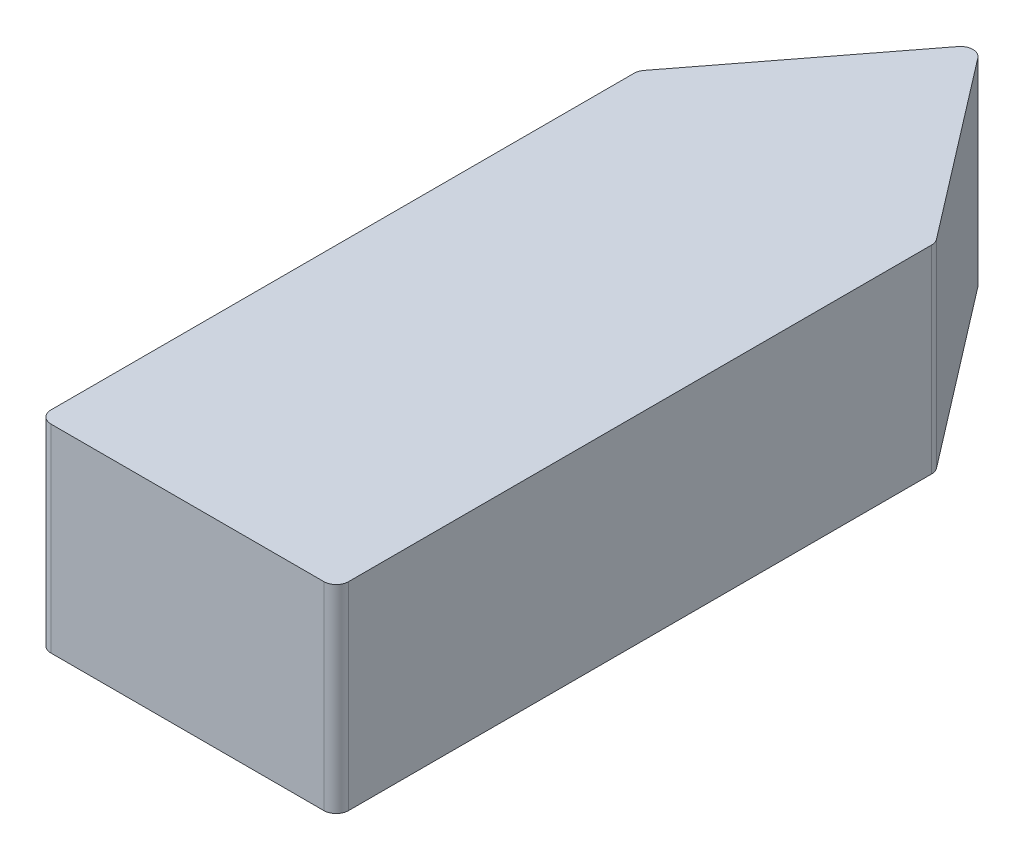
ISO-10303-21;
HEADER;
FILE_DESCRIPTION(('STEP AP214'),'2;1');
FILE_NAME('part.step','',(''),(''),'','','');
FILE_SCHEMA(('AUTOMOTIVE_DESIGN { 1 0 10303 214 1 1 1 1 }'));
ENDSEC;
DATA;
#1=APPLICATION_CONTEXT('core data for automotive mechanical design processes');
#2=APPLICATION_PROTOCOL_DEFINITION('international standard','automotive_design',2000,#1);
#3=PRODUCT_CONTEXT('',#1,'mechanical');
#4=PRODUCT('Part','Part','',(#3));
#5=PRODUCT_RELATED_PRODUCT_CATEGORY('part','',(#4));
#6=PRODUCT_DEFINITION_FORMATION('','',#4);
#7=PRODUCT_DEFINITION_CONTEXT('part definition',#1,'design');
#8=PRODUCT_DEFINITION('design','',#6,#7);
#9=PRODUCT_DEFINITION_SHAPE('','',#8);
#10=(LENGTH_UNIT() NAMED_UNIT(*) SI_UNIT(.MILLI.,.METRE.));
#11=(NAMED_UNIT(*) PLANE_ANGLE_UNIT() SI_UNIT($,.RADIAN.));
#12=(NAMED_UNIT(*) SI_UNIT($,.STERADIAN.) SOLID_ANGLE_UNIT());
#13=UNCERTAINTY_MEASURE_WITH_UNIT(LENGTH_MEASURE(1.E-05),#10,'distance_accuracy_value','');
#14=(GEOMETRIC_REPRESENTATION_CONTEXT(3) GLOBAL_UNCERTAINTY_ASSIGNED_CONTEXT((#13)) GLOBAL_UNIT_ASSIGNED_CONTEXT((#10,
#11,#12)) REPRESENTATION_CONTEXT('',''));
#15=CARTESIAN_POINT('',(0.,0.,0.));
#16=DIRECTION('',(0.,0.,1.));
#17=DIRECTION('',(1.,0.,0.));
#18=AXIS2_PLACEMENT_3D('',#15,#16,#17);
#19=CARTESIAN_POINT('',(17.4625,25.4,-1.5875));
#20=DIRECTION('',(0.,-1.,0.));
#21=DIRECTION('',(0.,0.,-1.));
#22=AXIS2_PLACEMENT_3D('',#19,#20,#21);
#23=CYLINDRICAL_SURFACE('',#22,1.5875);
#24=CARTESIAN_POINT('',(17.4625,0.,-1.5875));
#25=DIRECTION('',(0.,1.,0.));
#26=DIRECTION('',(0.,0.,1.));
#27=AXIS2_PLACEMENT_3D('',#24,#25,#26);
#28=CIRCLE('',#27,1.5875);
#29=CARTESIAN_POINT('',(17.4625,0.,0.));
#30=VERTEX_POINT('',#29);
#31=CARTESIAN_POINT('',(19.05,0.,-1.58750000000001));
#32=VERTEX_POINT('',#31);
#33=EDGE_CURVE('E114',#30,#32,#28,.T.);
#34=ORIENTED_EDGE('',*,*,#33,.T.);
#35=DIRECTION('',(0.,-1.,0.));
#36=VECTOR('',#35,1.);
#37=CARTESIAN_POINT('',(19.05,25.4,-1.58750000000001));
#38=LINE('',#37,#36);
#39=CARTESIAN_POINT('',(19.05,25.4,-1.58750000000001));
#40=VERTEX_POINT('',#39);
#41=EDGE_CURVE('E11',#40,#32,#38,.T.);
#42=ORIENTED_EDGE('',*,*,#41,.F.);
#43=CARTESIAN_POINT('',(17.4625,25.4,-1.5875));
#44=DIRECTION('',(0.,1.,0.));
#45=DIRECTION('',(0.,0.,1.));
#46=AXIS2_PLACEMENT_3D('',#43,#44,#45);
#47=CIRCLE('',#46,1.5875);
#48=CARTESIAN_POINT('',(17.4625,25.4,0.));
#49=VERTEX_POINT('',#48);
#50=EDGE_CURVE('E145',#49,#40,#47,.T.);
#51=ORIENTED_EDGE('',*,*,#50,.F.);
#52=DIRECTION('',(0.,-1.,0.));
#53=VECTOR('',#52,1.);
#54=CARTESIAN_POINT('',(17.4625,25.4,0.));
#55=LINE('',#54,#53);
#56=EDGE_CURVE('E127',#49,#30,#55,.T.);
#57=ORIENTED_EDGE('',*,*,#56,.T.);
#58=EDGE_LOOP('',(#34,#42,#51,#57));
#59=FACE_BOUND('',#58,.T.);
#60=ADVANCED_FACE('F34',(#59),#23,.T.);
#61=CARTESIAN_POINT('',(19.05,25.4,-1.58750000000001));
#62=DIRECTION('',(-1.,0.,0.));
#63=DIRECTION('',(0.,0.,1.));
#64=AXIS2_PLACEMENT_3D('',#61,#62,#63);
#65=PLANE('',#64);
#66=DIRECTION('',(0.,0.,-1.));
#67=VECTOR('',#66,1.);
#68=CARTESIAN_POINT('',(19.05,0.,-1.58750000000001));
#69=LINE('',#68,#67);
#70=CARTESIAN_POINT('',(19.05,0.,-76.2346730114295));
#71=VERTEX_POINT('',#70);
#72=EDGE_CURVE('E110',#32,#71,#69,.T.);
#73=ORIENTED_EDGE('',*,*,#72,.T.);
#74=DIRECTION('',(0.,-1.,0.));
#75=VECTOR('',#74,1.);
#76=CARTESIAN_POINT('',(19.05,25.4,-76.2346730114295));
#77=LINE('',#76,#75);
#78=CARTESIAN_POINT('',(19.05,25.4,-76.2346730114295));
#79=VERTEX_POINT('',#78);
#80=EDGE_CURVE('E41',#79,#71,#77,.T.);
#81=ORIENTED_EDGE('',*,*,#80,.F.);
#82=DIRECTION('',(0.,0.,-1.));
#83=VECTOR('',#82,1.);
#84=CARTESIAN_POINT('',(19.05,25.4,-1.58750000000001));
#85=LINE('',#84,#83);
#86=EDGE_CURVE('E123',#40,#79,#85,.T.);
#87=ORIENTED_EDGE('',*,*,#86,.F.);
#88=ORIENTED_EDGE('',*,*,#41,.T.);
#89=EDGE_LOOP('',(#73,#81,#87,#88));
#90=FACE_BOUND('',#89,.T.);
#91=ADVANCED_FACE('F122',(#90),#65,.F.);
#92=CARTESIAN_POINT('',(17.4625,25.4,-76.2346730114295));
#93=DIRECTION('',(0.,-1.,0.));
#94=DIRECTION('',(0.,0.,-1.));
#95=AXIS2_PLACEMENT_3D('',#92,#93,#94);
#96=CYLINDRICAL_SURFACE('',#95,1.5875);
#97=CARTESIAN_POINT('',(17.4625,0.,-76.2346730114295));
#98=DIRECTION('',(0.,1.,0.));
#99=DIRECTION('',(0.,0.,1.));
#100=AXIS2_PLACEMENT_3D('',#97,#98,#99);
#101=CIRCLE('',#100,1.5875);
#102=CARTESIAN_POINT('',(18.7219484277123,0.,-77.2010817799809));
#103=VERTEX_POINT('',#102);
#104=EDGE_CURVE('E116',#71,#103,#101,.T.);
#105=ORIENTED_EDGE('',*,*,#104,.T.);
#106=DIRECTION('',(0.,-1.,0.));
#107=VECTOR('',#106,1.);
#108=CARTESIAN_POINT('',(18.7219484277123,25.4,-77.2010817799809));
#109=LINE('',#108,#107);
#110=CARTESIAN_POINT('',(18.7219484277123,25.4,-77.2010817799809));
#111=VERTEX_POINT('',#110);
#112=EDGE_CURVE('E181',#111,#103,#109,.T.);
#113=ORIENTED_EDGE('',*,*,#112,.F.);
#114=CARTESIAN_POINT('',(17.4625,25.4,-76.2346730114295));
#115=DIRECTION('',(0.,1.,0.));
#116=DIRECTION('',(0.,0.,1.));
#117=AXIS2_PLACEMENT_3D('',#114,#115,#116);
#118=CIRCLE('',#117,1.5875);
#119=EDGE_CURVE('E148',#79,#111,#118,.T.);
#120=ORIENTED_EDGE('',*,*,#119,.F.);
#121=ORIENTED_EDGE('',*,*,#80,.T.);
#122=EDGE_LOOP('',(#105,#113,#120,#121));
#123=FACE_BOUND('',#122,.T.);
#124=ADVANCED_FACE('F185',(#123),#96,.T.);
#125=CARTESIAN_POINT('',(18.7219484277123,25.4,-77.2010817799809));
#126=DIRECTION('',(-0.793353340291234,0.,0.608761429008722));
#127=DIRECTION('',(0.608761429008722,0.,0.793353340291234));
#128=AXIS2_PLACEMENT_3D('',#125,#126,#127);
#129=PLANE('',#128);
#130=DIRECTION('',(-0.608761429008722,0.,-0.793353340291234));
#131=VECTOR('',#130,1.);
#132=CARTESIAN_POINT('',(18.7219484277123,0.,-77.2010817799809));
#133=LINE('',#132,#131);
#134=CARTESIAN_POINT('',(1.25944842771234,0.,-99.9586548532203));
#135=VERTEX_POINT('',#134);
#136=EDGE_CURVE('E131',#103,#135,#133,.T.);
#137=ORIENTED_EDGE('',*,*,#136,.T.);
#138=DIRECTION('',(0.,-1.,0.));
#139=VECTOR('',#138,1.);
#140=CARTESIAN_POINT('',(1.25944842771234,25.4,-99.9586548532203));
#141=LINE('',#140,#139);
#142=CARTESIAN_POINT('',(1.25944842771234,25.4,-99.9586548532203));
#143=VERTEX_POINT('',#142);
#144=EDGE_CURVE('E178',#143,#135,#141,.T.);
#145=ORIENTED_EDGE('',*,*,#144,.F.);
#146=DIRECTION('',(-0.608761429008722,0.,-0.793353340291234));
#147=VECTOR('',#146,1.);
#148=CARTESIAN_POINT('',(18.7219484277123,25.4,-77.2010817799809));
#149=LINE('',#148,#147);
#150=EDGE_CURVE('E150',#111,#143,#149,.T.);
#151=ORIENTED_EDGE('',*,*,#150,.F.);
#152=ORIENTED_EDGE('',*,*,#112,.T.);
#153=EDGE_LOOP('',(#137,#145,#151,#152));
#154=FACE_BOUND('',#153,.T.);
#155=ADVANCED_FACE('F193',(#154),#129,.F.);
#156=CARTESIAN_POINT('',(0.,25.4,-98.992246084669));
#157=DIRECTION('',(0.,-1.,0.));
#158=DIRECTION('',(0.,0.,-1.));
#159=AXIS2_PLACEMENT_3D('',#156,#157,#158);
#160=CYLINDRICAL_SURFACE('',#159,1.58749999999999);
#161=CARTESIAN_POINT('',(0.,0.,-98.992246084669));
#162=DIRECTION('',(0.,1.,0.));
#163=DIRECTION('',(0.,0.,1.));
#164=AXIS2_PLACEMENT_3D('',#161,#162,#163);
#165=CIRCLE('',#164,1.58749999999999);
#166=CARTESIAN_POINT('',(-1.25944842771234,0.,-99.9586548532203));
#167=VERTEX_POINT('',#166);
#168=EDGE_CURVE('E133',#135,#167,#165,.T.);
#169=ORIENTED_EDGE('',*,*,#168,.T.);
#170=DIRECTION('',(0.,-1.,0.));
#171=VECTOR('',#170,1.);
#172=CARTESIAN_POINT('',(-1.25944842771234,25.4,-99.9586548532203));
#173=LINE('',#172,#171);
#174=CARTESIAN_POINT('',(-1.25944842771234,25.4,-99.9586548532203));
#175=VERTEX_POINT('',#174);
#176=EDGE_CURVE('E175',#175,#167,#173,.T.);
#177=ORIENTED_EDGE('',*,*,#176,.F.);
#178=CARTESIAN_POINT('',(0.,25.4,-98.992246084669));
#179=DIRECTION('',(0.,1.,0.));
#180=DIRECTION('',(0.,0.,1.));
#181=AXIS2_PLACEMENT_3D('',#178,#179,#180);
#182=CIRCLE('',#181,1.58749999999999);
#183=EDGE_CURVE('E152',#143,#175,#182,.T.);
#184=ORIENTED_EDGE('',*,*,#183,.F.);
#185=ORIENTED_EDGE('',*,*,#144,.T.);
#186=EDGE_LOOP('',(#169,#177,#184,#185));
#187=FACE_BOUND('',#186,.T.);
#188=ADVANCED_FACE('F196',(#187),#160,.T.);
#189=CARTESIAN_POINT('',(-18.7219484277123,25.4,-77.2010817799809));
#190=DIRECTION('',(0.793353340291234,0.,0.608761429008722));
#191=DIRECTION('',(0.608761429008722,0.,-0.793353340291234));
#192=AXIS2_PLACEMENT_3D('',#189,#190,#191);
#193=PLANE('',#192);
#194=DIRECTION('',(-0.608761429008722,0.,0.793353340291234));
#195=VECTOR('',#194,1.);
#196=CARTESIAN_POINT('',(-18.7219484277123,0.,-77.2010817799809));
#197=LINE('',#196,#195);
#198=CARTESIAN_POINT('',(-18.7219484277123,0.,-77.2010817799809));
#199=VERTEX_POINT('',#198);
#200=EDGE_CURVE('E135',#167,#199,#197,.T.);
#201=ORIENTED_EDGE('',*,*,#200,.T.);
#202=DIRECTION('',(0.,-1.,0.));
#203=VECTOR('',#202,1.);
#204=CARTESIAN_POINT('',(-18.7219484277123,25.4,-77.2010817799809));
#205=LINE('',#204,#203);
#206=CARTESIAN_POINT('',(-18.7219484277123,25.4,-77.2010817799809));
#207=VERTEX_POINT('',#206);
#208=EDGE_CURVE('E172',#207,#199,#205,.T.);
#209=ORIENTED_EDGE('',*,*,#208,.F.);
#210=DIRECTION('',(-0.608761429008722,0.,0.793353340291234));
#211=VECTOR('',#210,1.);
#212=CARTESIAN_POINT('',(-18.7219484277123,25.4,-77.2010817799809));
#213=LINE('',#212,#211);
#214=EDGE_CURVE('E154',#175,#207,#213,.T.);
#215=ORIENTED_EDGE('',*,*,#214,.F.);
#216=ORIENTED_EDGE('',*,*,#176,.T.);
#217=EDGE_LOOP('',(#201,#209,#215,#216));
#218=FACE_BOUND('',#217,.T.);
#219=ADVANCED_FACE('F201',(#218),#193,.F.);
#220=CARTESIAN_POINT('',(-17.4625,25.4,-76.2346730114295));
#221=DIRECTION('',(0.,-1.,0.));
#222=DIRECTION('',(0.,0.,-1.));
#223=AXIS2_PLACEMENT_3D('',#220,#221,#222);
#224=CYLINDRICAL_SURFACE('',#223,1.5875);
#225=CARTESIAN_POINT('',(-17.4625,0.,-76.2346730114295));
#226=DIRECTION('',(0.,1.,0.));
#227=DIRECTION('',(0.,0.,-1.));
#228=AXIS2_PLACEMENT_3D('',#225,#226,#227);
#229=CIRCLE('',#228,1.5875);
#230=CARTESIAN_POINT('',(-19.05,0.,-76.2346730114295));
#231=VERTEX_POINT('',#230);
#232=EDGE_CURVE('E137',#199,#231,#229,.T.);
#233=ORIENTED_EDGE('',*,*,#232,.T.);
#234=DIRECTION('',(0.,-1.,0.));
#235=VECTOR('',#234,1.);
#236=CARTESIAN_POINT('',(-19.05,25.4,-76.2346730114295));
#237=LINE('',#236,#235);
#238=CARTESIAN_POINT('',(-19.05,25.4,-76.2346730114295));
#239=VERTEX_POINT('',#238);
#240=EDGE_CURVE('E169',#239,#231,#237,.T.);
#241=ORIENTED_EDGE('',*,*,#240,.F.);
#242=CARTESIAN_POINT('',(-17.4625,25.4,-76.2346730114295));
#243=DIRECTION('',(0.,1.,0.));
#244=DIRECTION('',(0.,0.,-1.));
#245=AXIS2_PLACEMENT_3D('',#242,#243,#244);
#246=CIRCLE('',#245,1.5875);
#247=EDGE_CURVE('E156',#207,#239,#246,.T.);
#248=ORIENTED_EDGE('',*,*,#247,.F.);
#249=ORIENTED_EDGE('',*,*,#208,.T.);
#250=EDGE_LOOP('',(#233,#241,#248,#249));
#251=FACE_BOUND('',#250,.T.);
#252=ADVANCED_FACE('F207',(#251),#224,.T.);
#253=CARTESIAN_POINT('',(-19.05,25.4,-1.58750000000001));
#254=DIRECTION('',(1.,0.,0.));
#255=DIRECTION('',(0.,0.,-1.));
#256=AXIS2_PLACEMENT_3D('',#253,#254,#255);
#257=PLANE('',#256);
#258=DIRECTION('',(0.,0.,1.));
#259=VECTOR('',#258,1.);
#260=CARTESIAN_POINT('',(-19.05,0.,-1.58750000000001));
#261=LINE('',#260,#259);
#262=CARTESIAN_POINT('',(-19.05,0.,-1.58750000000001));
#263=VERTEX_POINT('',#262);
#264=EDGE_CURVE('E139',#231,#263,#261,.T.);
#265=ORIENTED_EDGE('',*,*,#264,.T.);
#266=DIRECTION('',(0.,-1.,0.));
#267=VECTOR('',#266,1.);
#268=CARTESIAN_POINT('',(-19.05,25.4,-1.58750000000001));
#269=LINE('',#268,#267);
#270=CARTESIAN_POINT('',(-19.05,25.4,-1.58750000000001));
#271=VERTEX_POINT('',#270);
#272=EDGE_CURVE('E166',#271,#263,#269,.T.);
#273=ORIENTED_EDGE('',*,*,#272,.F.);
#274=DIRECTION('',(0.,0.,1.));
#275=VECTOR('',#274,1.);
#276=CARTESIAN_POINT('',(-19.05,25.4,-1.58750000000001));
#277=LINE('',#276,#275);
#278=EDGE_CURVE('E158',#239,#271,#277,.T.);
#279=ORIENTED_EDGE('',*,*,#278,.F.);
#280=ORIENTED_EDGE('',*,*,#240,.T.);
#281=EDGE_LOOP('',(#265,#273,#279,#280));
#282=FACE_BOUND('',#281,.T.);
#283=ADVANCED_FACE('F211',(#282),#257,.F.);
#284=CARTESIAN_POINT('',(-17.4625,25.4,-1.5875));
#285=DIRECTION('',(0.,-1.,0.));
#286=DIRECTION('',(0.,0.,-1.));
#287=AXIS2_PLACEMENT_3D('',#284,#285,#286);
#288=CYLINDRICAL_SURFACE('',#287,1.5875);
#289=CARTESIAN_POINT('',(-17.4625,0.,-1.5875));
#290=DIRECTION('',(0.,1.,0.));
#291=DIRECTION('',(0.,0.,1.));
#292=AXIS2_PLACEMENT_3D('',#289,#290,#291);
#293=CIRCLE('',#292,1.5875);
#294=CARTESIAN_POINT('',(-17.4625,0.,0.));
#295=VERTEX_POINT('',#294);
#296=EDGE_CURVE('E141',#263,#295,#293,.T.);
#297=ORIENTED_EDGE('',*,*,#296,.T.);
#298=DIRECTION('',(0.,-1.,0.));
#299=VECTOR('',#298,1.);
#300=CARTESIAN_POINT('',(-17.4625,25.4,0.));
#301=LINE('',#300,#299);
#302=CARTESIAN_POINT('',(-17.4625,25.4,0.));
#303=VERTEX_POINT('',#302);
#304=EDGE_CURVE('E163',#303,#295,#301,.T.);
#305=ORIENTED_EDGE('',*,*,#304,.F.);
#306=CARTESIAN_POINT('',(-17.4625,25.4,-1.5875));
#307=DIRECTION('',(0.,1.,0.));
#308=DIRECTION('',(0.,0.,1.));
#309=AXIS2_PLACEMENT_3D('',#306,#307,#308);
#310=CIRCLE('',#309,1.5875);
#311=EDGE_CURVE('E53',#271,#303,#310,.T.);
#312=ORIENTED_EDGE('',*,*,#311,.F.);
#313=ORIENTED_EDGE('',*,*,#272,.T.);
#314=EDGE_LOOP('',(#297,#305,#312,#313));
#315=FACE_BOUND('',#314,.T.);
#316=ADVANCED_FACE('F214',(#315),#288,.T.);
#317=CARTESIAN_POINT('',(-17.4625,25.4,0.));
#318=DIRECTION('',(0.,0.,-1.));
#319=DIRECTION('',(-1.,0.,0.));
#320=AXIS2_PLACEMENT_3D('',#317,#318,#319);
#321=PLANE('',#320);
#322=DIRECTION('',(1.,0.,0.));
#323=VECTOR('',#322,1.);
#324=CARTESIAN_POINT('',(-17.4625,0.,0.));
#325=LINE('',#324,#323);
#326=EDGE_CURVE('E143',#295,#30,#325,.T.);
#327=ORIENTED_EDGE('',*,*,#326,.T.);
#328=ORIENTED_EDGE('',*,*,#56,.F.);
#329=DIRECTION('',(1.,0.,0.));
#330=VECTOR('',#329,1.);
#331=CARTESIAN_POINT('',(-17.4625,25.4,0.));
#332=LINE('',#331,#330);
#333=EDGE_CURVE('E48',#303,#49,#332,.T.);
#334=ORIENTED_EDGE('',*,*,#333,.F.);
#335=ORIENTED_EDGE('',*,*,#304,.T.);
#336=EDGE_LOOP('',(#327,#328,#334,#335));
#337=FACE_BOUND('',#336,.T.);
#338=ADVANCED_FACE('F216',(#337),#321,.F.);
#339=CARTESIAN_POINT('',(17.4625,25.4,-1.5875));
#340=DIRECTION('',(0.,1.,0.));
#341=DIRECTION('',(0.,0.,1.));
#342=AXIS2_PLACEMENT_3D('',#339,#340,#341);
#343=PLANE('',#342);
#344=ORIENTED_EDGE('',*,*,#50,.T.);
#345=ORIENTED_EDGE('',*,*,#86,.T.);
#346=ORIENTED_EDGE('',*,*,#119,.T.);
#347=ORIENTED_EDGE('',*,*,#150,.T.);
#348=ORIENTED_EDGE('',*,*,#183,.T.);
#349=ORIENTED_EDGE('',*,*,#214,.T.);
#350=ORIENTED_EDGE('',*,*,#247,.T.);
#351=ORIENTED_EDGE('',*,*,#278,.T.);
#352=ORIENTED_EDGE('',*,*,#311,.T.);
#353=ORIENTED_EDGE('',*,*,#333,.T.);
#354=EDGE_LOOP('',(#344,#345,#346,#347,#348,#349,#350,#351,#352,#353));
#355=FACE_BOUND('',#354,.T.);
#356=ADVANCED_FACE('F188',(#355),#343,.T.);
#357=CARTESIAN_POINT('',(17.4625,0.,-1.5875));
#358=DIRECTION('',(0.,1.,0.));
#359=DIRECTION('',(0.,0.,1.));
#360=AXIS2_PLACEMENT_3D('',#357,#358,#359);
#361=PLANE('',#360);
#362=ORIENTED_EDGE('',*,*,#33,.F.);
#363=ORIENTED_EDGE('',*,*,#326,.F.);
#364=ORIENTED_EDGE('',*,*,#296,.F.);
#365=ORIENTED_EDGE('',*,*,#264,.F.);
#366=ORIENTED_EDGE('',*,*,#232,.F.);
#367=ORIENTED_EDGE('',*,*,#200,.F.);
#368=ORIENTED_EDGE('',*,*,#168,.F.);
#369=ORIENTED_EDGE('',*,*,#136,.F.);
#370=ORIENTED_EDGE('',*,*,#104,.F.);
#371=ORIENTED_EDGE('',*,*,#72,.F.);
#372=EDGE_LOOP('',(#362,#363,#364,#365,#366,#367,#368,#369,#370,#371));
#373=FACE_BOUND('',#372,.T.);
#374=ADVANCED_FACE('F111',(#373),#361,.F.);
#375=CLOSED_SHELL('',(#60,#91,#124,#155,#188,#219,#252,#283,#316,#338,#356,#374));
#376=MANIFOLD_SOLID_BREP('B2',#375);
#377=ADVANCED_BREP_SHAPE_REPRESENTATION('',(#18,#376),#14);
#378=SHAPE_DEFINITION_REPRESENTATION(#9,#377);
ENDSEC;
END-ISO-10303-21;
